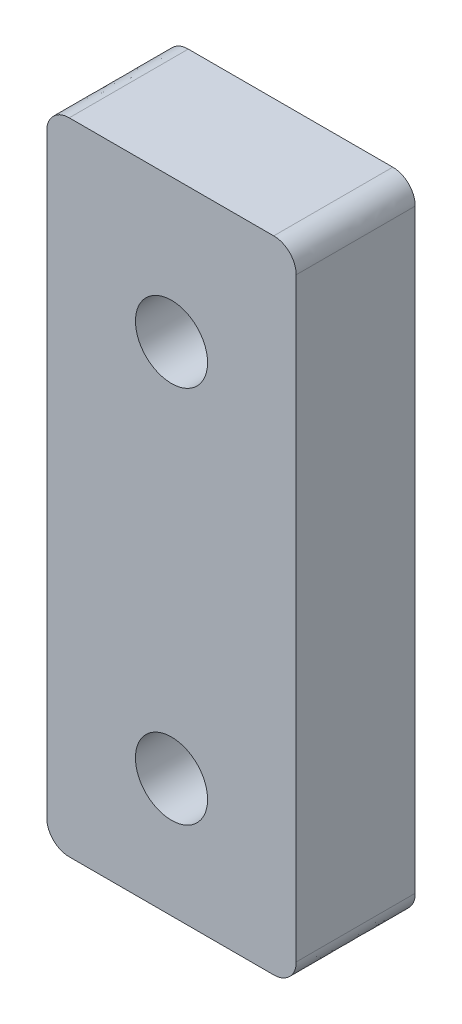
ISO-10303-21;
HEADER;
FILE_DESCRIPTION(('STEP AP214'),'2;1');
FILE_NAME('part.step','',(''),(''),'','','');
FILE_SCHEMA(('AUTOMOTIVE_DESIGN { 1 0 10303 214 1 1 1 1 }'));
ENDSEC;
DATA;
#1=APPLICATION_CONTEXT('core data for automotive mechanical design processes');
#2=APPLICATION_PROTOCOL_DEFINITION('international standard','automotive_design',2000,#1);
#3=PRODUCT_CONTEXT('',#1,'mechanical');
#4=PRODUCT('Part','Part','',(#3));
#5=PRODUCT_RELATED_PRODUCT_CATEGORY('part','',(#4));
#6=PRODUCT_DEFINITION_FORMATION('','',#4);
#7=PRODUCT_DEFINITION_CONTEXT('part definition',#1,'design');
#8=PRODUCT_DEFINITION('design','',#6,#7);
#9=PRODUCT_DEFINITION_SHAPE('','',#8);
#10=(LENGTH_UNIT() NAMED_UNIT(*) SI_UNIT(.MILLI.,.METRE.));
#11=(NAMED_UNIT(*) PLANE_ANGLE_UNIT() SI_UNIT($,.RADIAN.));
#12=(NAMED_UNIT(*) SI_UNIT($,.STERADIAN.) SOLID_ANGLE_UNIT());
#13=UNCERTAINTY_MEASURE_WITH_UNIT(LENGTH_MEASURE(1.E-05),#10,'distance_accuracy_value','');
#14=(GEOMETRIC_REPRESENTATION_CONTEXT(3) GLOBAL_UNCERTAINTY_ASSIGNED_CONTEXT((#13)) GLOBAL_UNIT_ASSIGNED_CONTEXT((#10,
#11,#12)) REPRESENTATION_CONTEXT('',''));
#15=CARTESIAN_POINT('',(0.,0.,0.));
#16=DIRECTION('',(0.,0.,1.));
#17=DIRECTION('',(1.,0.,0.));
#18=AXIS2_PLACEMENT_3D('',#15,#16,#17);
#19=CARTESIAN_POINT('',(-243.94235,141.1679875,6.35));
#20=DIRECTION('',(0.,0.,1.));
#21=DIRECTION('',(1.,0.,0.));
#22=AXIS2_PLACEMENT_3D('',#19,#20,#21);
#23=PLANE('',#22);
#24=CARTESIAN_POINT('',(-250.245,133.8944,6.35));
#25=DIRECTION('',(0.,0.,1.));
#26=DIRECTION('',(1.,0.,0.));
#27=AXIS2_PLACEMENT_3D('',#24,#25,#26);
#28=CIRCLE('',#27,1.92430000000001);
#29=CARTESIAN_POINT('',(-248.3207,133.8944,6.35));
#30=VERTEX_POINT('',#29);
#31=EDGE_CURVE('E208',#30,#30,#28,.T.);
#32=ORIENTED_EDGE('',*,*,#31,.F.);
#33=EDGE_LOOP('',(#32));
#34=FACE_BOUND('',#33,.T.);
#35=CARTESIAN_POINT('',(-243.5919,140.3197,6.35));
#36=CARTESIAN_POINT('',(-243.5919,140.9838,6.35));
#37=CARTESIAN_POINT('',(-244.1268,141.5182,6.35));
#38=CARTESIAN_POINT('',(-244.7908,141.5182,6.35));
#39=B_SPLINE_CURVE_WITH_KNOTS('',3,(#35,#36,#37,#38),.UNSPECIFIED.,.F.,.F.,(4,4),
(0.111111111111111,0.222222222222222),.UNSPECIFIED.);
#40=CARTESIAN_POINT('',(-243.5919,140.3197,6.35));
#41=VERTEX_POINT('',#40);
#42=CARTESIAN_POINT('',(-244.7908,141.5182,6.35));
#43=VERTEX_POINT('',#42);
#44=EDGE_CURVE('E213',#41,#43,#39,.T.);
#45=ORIENTED_EDGE('',*,*,#44,.T.);
#46=DIRECTION('',(-1.,0.,0.));
#47=VECTOR('',#46,1.);
#48=CARTESIAN_POINT('',(-255.7004,141.5182,6.35));
#49=LINE('',#48,#47);
#50=CARTESIAN_POINT('',(-255.7004,141.5182,6.35));
#51=VERTEX_POINT('',#50);
#52=EDGE_CURVE('E94',#43,#51,#49,.T.);
#53=ORIENTED_EDGE('',*,*,#52,.T.);
#54=CARTESIAN_POINT('',(-255.7004,141.5182,6.35));
#55=CARTESIAN_POINT('',(-256.3648,141.5182,6.35));
#56=CARTESIAN_POINT('',(-256.8997,140.9838,6.35));
#57=CARTESIAN_POINT('',(-256.8997,140.3197,6.35));
#58=B_SPLINE_CURVE_WITH_KNOTS('',3,(#54,#55,#56,#57),.UNSPECIFIED.,.F.,.F.,(4,4),
(0.777777777777778,1.),.UNSPECIFIED.);
#59=CARTESIAN_POINT('',(-256.8997,140.3197,6.35));
#60=VERTEX_POINT('',#59);
#61=EDGE_CURVE('E160',#51,#60,#58,.T.);
#62=ORIENTED_EDGE('',*,*,#61,.T.);
#63=DIRECTION('',(0.,-1.,0.));
#64=VECTOR('',#63,1.);
#65=CARTESIAN_POINT('',(-256.8997,108.5737,6.35));
#66=LINE('',#65,#64);
#67=CARTESIAN_POINT('',(-256.8997,108.5737,6.35));
#68=VERTEX_POINT('',#67);
#69=EDGE_CURVE('E155',#60,#68,#66,.T.);
#70=ORIENTED_EDGE('',*,*,#69,.T.);
#71=CARTESIAN_POINT('',(-256.8997,108.5737,6.35));
#72=CARTESIAN_POINT('',(-256.8997,107.9096,6.35));
#73=CARTESIAN_POINT('',(-256.3648,107.3747,6.35));
#74=CARTESIAN_POINT('',(-255.7004,107.3747,6.35));
#75=B_SPLINE_CURVE_WITH_KNOTS('',3,(#71,#72,#73,#74),.UNSPECIFIED.,.F.,.F.,(4,4),
(0.555555555555556,0.666666666666667),.UNSPECIFIED.);
#76=CARTESIAN_POINT('',(-255.7004,107.3747,6.35));
#77=VERTEX_POINT('',#76);
#78=EDGE_CURVE('E113',#68,#77,#75,.T.);
#79=ORIENTED_EDGE('',*,*,#78,.T.);
#80=DIRECTION('',(1.,0.,0.));
#81=VECTOR('',#80,1.);
#82=CARTESIAN_POINT('',(-244.7908,107.3747,6.35));
#83=LINE('',#82,#81);
#84=CARTESIAN_POINT('',(-244.7908,107.3747,6.35));
#85=VERTEX_POINT('',#84);
#86=EDGE_CURVE('E107',#77,#85,#83,.T.);
#87=ORIENTED_EDGE('',*,*,#86,.T.);
#88=CARTESIAN_POINT('',(-244.7908,107.3747,6.35));
#89=CARTESIAN_POINT('',(-244.1268,107.3747,6.35));
#90=CARTESIAN_POINT('',(-243.5919,107.9096,6.35));
#91=CARTESIAN_POINT('',(-243.5919,108.5737,6.35));
#92=B_SPLINE_CURVE_WITH_KNOTS('',3,(#88,#89,#90,#91),.UNSPECIFIED.,.F.,.F.,(4,4),
(0.333333333333333,0.444444444444444),.UNSPECIFIED.);
#93=CARTESIAN_POINT('',(-243.5919,108.5737,6.35));
#94=VERTEX_POINT('',#93);
#95=EDGE_CURVE('E111',#85,#94,#92,.T.);
#96=ORIENTED_EDGE('',*,*,#95,.T.);
#97=DIRECTION('',(0.,1.,0.));
#98=VECTOR('',#97,1.);
#99=CARTESIAN_POINT('',(-243.5919,140.3197,6.35));
#100=LINE('',#99,#98);
#101=EDGE_CURVE('E51',#94,#41,#100,.T.);
#102=ORIENTED_EDGE('',*,*,#101,.T.);
#103=EDGE_LOOP('',(#45,#53,#62,#70,#79,#87,#96,#102));
#104=FACE_BOUND('',#103,.T.);
#105=CARTESIAN_POINT('',(-250.245,113.71655,6.35));
#106=DIRECTION('',(0.,0.,1.));
#107=DIRECTION('',(1.,0.,0.));
#108=AXIS2_PLACEMENT_3D('',#105,#106,#107);
#109=CIRCLE('',#108,1.92514999999998);
#110=CARTESIAN_POINT('',(-248.31985,113.71655,6.35));
#111=VERTEX_POINT('',#110);
#112=EDGE_CURVE('E199',#111,#111,#109,.T.);
#113=ORIENTED_EDGE('',*,*,#112,.F.);
#114=EDGE_LOOP('',(#113));
#115=FACE_BOUND('',#114,.T.);
#116=ADVANCED_FACE('F33',(#34,#104,#115),#23,.T.);
#117=CARTESIAN_POINT('',(-243.94235,141.1679875,0.));
#118=DIRECTION('',(0.,0.,1.));
#119=DIRECTION('',(1.,0.,0.));
#120=AXIS2_PLACEMENT_3D('',#117,#118,#119);
#121=PLANE('',#120);
#122=CARTESIAN_POINT('',(-243.5919,140.3197,0.));
#123=CARTESIAN_POINT('',(-243.5919,140.9838,0.));
#124=CARTESIAN_POINT('',(-244.1268,141.5182,0.));
#125=CARTESIAN_POINT('',(-244.7908,141.5182,0.));
#126=B_SPLINE_CURVE_WITH_KNOTS('',3,(#122,#123,#124,#125),.UNSPECIFIED.,.F.,.F.,(4,4),
(0.111111111111111,0.222222222222222),.UNSPECIFIED.);
#127=CARTESIAN_POINT('',(-243.5919,140.3197,0.));
#128=VERTEX_POINT('',#127);
#129=CARTESIAN_POINT('',(-244.7908,141.5182,0.));
#130=VERTEX_POINT('',#129);
#131=EDGE_CURVE('E211',#128,#130,#126,.T.);
#132=ORIENTED_EDGE('',*,*,#131,.F.);
#133=DIRECTION('',(0.,1.,0.));
#134=VECTOR('',#133,1.);
#135=CARTESIAN_POINT('',(-243.5919,140.3197,0.));
#136=LINE('',#135,#134);
#137=CARTESIAN_POINT('',(-243.5919,108.5737,0.));
#138=VERTEX_POINT('',#137);
#139=EDGE_CURVE('E86',#138,#128,#136,.T.);
#140=ORIENTED_EDGE('',*,*,#139,.F.);
#141=CARTESIAN_POINT('',(-244.7908,107.3747,0.));
#142=CARTESIAN_POINT('',(-244.1268,107.3747,0.));
#143=CARTESIAN_POINT('',(-243.5919,107.9096,0.));
#144=CARTESIAN_POINT('',(-243.5919,108.5737,0.));
#145=B_SPLINE_CURVE_WITH_KNOTS('',3,(#141,#142,#143,#144),.UNSPECIFIED.,.F.,.F.,(4,4),
(0.333333333333333,0.444444444444444),.UNSPECIFIED.);
#146=CARTESIAN_POINT('',(-244.7908,107.3747,0.));
#147=VERTEX_POINT('',#146);
#148=EDGE_CURVE('E80',#147,#138,#145,.T.);
#149=ORIENTED_EDGE('',*,*,#148,.F.);
#150=DIRECTION('',(1.,0.,0.));
#151=VECTOR('',#150,1.);
#152=CARTESIAN_POINT('',(-244.7908,107.3747,0.));
#153=LINE('',#152,#151);
#154=CARTESIAN_POINT('',(-255.7004,107.3747,0.));
#155=VERTEX_POINT('',#154);
#156=EDGE_CURVE('E121',#155,#147,#153,.T.);
#157=ORIENTED_EDGE('',*,*,#156,.F.);
#158=CARTESIAN_POINT('',(-256.8997,108.5737,0.));
#159=CARTESIAN_POINT('',(-256.8997,107.9096,0.));
#160=CARTESIAN_POINT('',(-256.3648,107.3747,0.));
#161=CARTESIAN_POINT('',(-255.7004,107.3747,0.));
#162=B_SPLINE_CURVE_WITH_KNOTS('',3,(#158,#159,#160,#161),.UNSPECIFIED.,.F.,.F.,(4,4),
(0.555555555555556,0.666666666666667),.UNSPECIFIED.);
#163=CARTESIAN_POINT('',(-256.8997,108.5737,0.));
#164=VERTEX_POINT('',#163);
#165=EDGE_CURVE('E248',#164,#155,#162,.T.);
#166=ORIENTED_EDGE('',*,*,#165,.F.);
#167=DIRECTION('',(0.,-1.,0.));
#168=VECTOR('',#167,1.);
#169=CARTESIAN_POINT('',(-256.8997,108.5737,0.));
#170=LINE('',#169,#168);
#171=CARTESIAN_POINT('',(-256.8997,140.3197,0.));
#172=VERTEX_POINT('',#171);
#173=EDGE_CURVE('E246',#172,#164,#170,.T.);
#174=ORIENTED_EDGE('',*,*,#173,.F.);
#175=CARTESIAN_POINT('',(-255.7004,141.5182,0.));
#176=CARTESIAN_POINT('',(-256.3648,141.5182,0.));
#177=CARTESIAN_POINT('',(-256.8997,140.9838,0.));
#178=CARTESIAN_POINT('',(-256.8997,140.3197,0.));
#179=B_SPLINE_CURVE_WITH_KNOTS('',3,(#175,#176,#177,#178),.UNSPECIFIED.,.F.,.F.,(4,4),
(0.777777777777778,1.),.UNSPECIFIED.);
#180=CARTESIAN_POINT('',(-255.7004,141.5182,0.));
#181=VERTEX_POINT('',#180);
#182=EDGE_CURVE('E240',#181,#172,#179,.T.);
#183=ORIENTED_EDGE('',*,*,#182,.F.);
#184=DIRECTION('',(-1.,0.,0.));
#185=VECTOR('',#184,1.);
#186=CARTESIAN_POINT('',(-255.7004,141.5182,0.));
#187=LINE('',#186,#185);
#188=EDGE_CURVE('E244',#130,#181,#187,.T.);
#189=ORIENTED_EDGE('',*,*,#188,.F.);
#190=EDGE_LOOP('',(#132,#140,#149,#157,#166,#174,#183,#189));
#191=FACE_BOUND('',#190,.T.);
#192=CARTESIAN_POINT('',(-250.245,133.8944,0.));
#193=DIRECTION('',(0.,0.,1.));
#194=DIRECTION('',(1.,0.,0.));
#195=AXIS2_PLACEMENT_3D('',#192,#193,#194);
#196=CIRCLE('',#195,1.92430000000001);
#197=CARTESIAN_POINT('',(-248.3207,133.8944,0.));
#198=VERTEX_POINT('',#197);
#199=EDGE_CURVE('E205',#198,#198,#196,.T.);
#200=ORIENTED_EDGE('',*,*,#199,.T.);
#201=EDGE_LOOP('',(#200));
#202=FACE_BOUND('',#201,.T.);
#203=CARTESIAN_POINT('',(-250.245,113.71655,0.));
#204=DIRECTION('',(0.,0.,1.));
#205=DIRECTION('',(1.,0.,0.));
#206=AXIS2_PLACEMENT_3D('',#203,#204,#205);
#207=CIRCLE('',#206,1.92514999999998);
#208=CARTESIAN_POINT('',(-248.31985,113.71655,0.));
#209=VERTEX_POINT('',#208);
#210=EDGE_CURVE('E202',#209,#209,#207,.T.);
#211=ORIENTED_EDGE('',*,*,#210,.T.);
#212=EDGE_LOOP('',(#211));
#213=FACE_BOUND('',#212,.T.);
#214=ADVANCED_FACE('F176',(#191,#202,#213),#121,.F.);
#215=DIRECTION('',(0.,0.,-1.));
#216=VECTOR('',#215,1.);
#217=SURFACE_OF_LINEAR_EXTRUSION('',#39,#216);
#218=ORIENTED_EDGE('',*,*,#131,.T.);
#219=DIRECTION('',(0.,0.,-1.));
#220=VECTOR('',#219,1.);
#221=CARTESIAN_POINT('',(-244.7908,141.5182,6.35));
#222=LINE('',#221,#220);
#223=EDGE_CURVE('E11',#43,#130,#222,.T.);
#224=ORIENTED_EDGE('',*,*,#223,.F.);
#225=ORIENTED_EDGE('',*,*,#44,.F.);
#226=DIRECTION('',(0.,0.,-1.));
#227=VECTOR('',#226,1.);
#228=CARTESIAN_POINT('',(-243.5919,140.3197,6.35));
#229=LINE('',#228,#227);
#230=EDGE_CURVE('E127',#41,#128,#229,.T.);
#231=ORIENTED_EDGE('',*,*,#230,.T.);
#232=EDGE_LOOP('',(#218,#224,#225,#231));
#233=FACE_BOUND('',#232,.T.);
#234=ADVANCED_FACE('F35',(#233),#217,.F.);
#235=CARTESIAN_POINT('',(-255.7004,141.5182,6.35));
#236=DIRECTION('',(0.,-1.,0.));
#237=DIRECTION('',(0.,0.,-1.));
#238=AXIS2_PLACEMENT_3D('',#235,#236,#237);
#239=PLANE('',#238);
#240=ORIENTED_EDGE('',*,*,#188,.T.);
#241=DIRECTION('',(0.,0.,-1.));
#242=VECTOR('',#241,1.);
#243=CARTESIAN_POINT('',(-255.7004,141.5182,6.35));
#244=LINE('',#243,#242);
#245=EDGE_CURVE('E43',#51,#181,#244,.T.);
#246=ORIENTED_EDGE('',*,*,#245,.F.);
#247=ORIENTED_EDGE('',*,*,#52,.F.);
#248=ORIENTED_EDGE('',*,*,#223,.T.);
#249=EDGE_LOOP('',(#240,#246,#247,#248));
#250=FACE_BOUND('',#249,.T.);
#251=ADVANCED_FACE('F170',(#250),#239,.F.);
#252=DIRECTION('',(0.,0.,-1.));
#253=VECTOR('',#252,1.);
#254=SURFACE_OF_LINEAR_EXTRUSION('',#58,#253);
#255=ORIENTED_EDGE('',*,*,#182,.T.);
#256=DIRECTION('',(0.,0.,-1.));
#257=VECTOR('',#256,1.);
#258=CARTESIAN_POINT('',(-256.8997,140.3197,6.35));
#259=LINE('',#258,#257);
#260=EDGE_CURVE('E234',#60,#172,#259,.T.);
#261=ORIENTED_EDGE('',*,*,#260,.F.);
#262=ORIENTED_EDGE('',*,*,#61,.F.);
#263=ORIENTED_EDGE('',*,*,#245,.T.);
#264=EDGE_LOOP('',(#255,#261,#262,#263));
#265=FACE_BOUND('',#264,.T.);
#266=ADVANCED_FACE('F168',(#265),#254,.F.);
#267=CARTESIAN_POINT('',(-256.8997,108.5737,6.35));
#268=DIRECTION('',(1.,0.,0.));
#269=DIRECTION('',(0.,0.,-1.));
#270=AXIS2_PLACEMENT_3D('',#267,#268,#269);
#271=PLANE('',#270);
#272=ORIENTED_EDGE('',*,*,#173,.T.);
#273=DIRECTION('',(0.,0.,-1.));
#274=VECTOR('',#273,1.);
#275=CARTESIAN_POINT('',(-256.8997,108.5737,6.35));
#276=LINE('',#275,#274);
#277=EDGE_CURVE('E231',#68,#164,#276,.T.);
#278=ORIENTED_EDGE('',*,*,#277,.F.);
#279=ORIENTED_EDGE('',*,*,#69,.F.);
#280=ORIENTED_EDGE('',*,*,#260,.T.);
#281=EDGE_LOOP('',(#272,#278,#279,#280));
#282=FACE_BOUND('',#281,.T.);
#283=ADVANCED_FACE('F148',(#282),#271,.F.);
#284=DIRECTION('',(0.,0.,-1.));
#285=VECTOR('',#284,1.);
#286=SURFACE_OF_LINEAR_EXTRUSION('',#75,#285);
#287=ORIENTED_EDGE('',*,*,#165,.T.);
#288=DIRECTION('',(0.,0.,-1.));
#289=VECTOR('',#288,1.);
#290=CARTESIAN_POINT('',(-255.7004,107.3747,6.35));
#291=LINE('',#290,#289);
#292=EDGE_CURVE('E122',#77,#155,#291,.T.);
#293=ORIENTED_EDGE('',*,*,#292,.F.);
#294=ORIENTED_EDGE('',*,*,#78,.F.);
#295=ORIENTED_EDGE('',*,*,#277,.T.);
#296=EDGE_LOOP('',(#287,#293,#294,#295));
#297=FACE_BOUND('',#296,.T.);
#298=ADVANCED_FACE('F145',(#297),#286,.F.);
#299=CARTESIAN_POINT('',(-244.7908,107.3747,6.35));
#300=DIRECTION('',(0.,1.,0.));
#301=DIRECTION('',(0.,0.,1.));
#302=AXIS2_PLACEMENT_3D('',#299,#300,#301);
#303=PLANE('',#302);
#304=ORIENTED_EDGE('',*,*,#156,.T.);
#305=DIRECTION('',(0.,0.,-1.));
#306=VECTOR('',#305,1.);
#307=CARTESIAN_POINT('',(-244.7908,107.3747,6.35));
#308=LINE('',#307,#306);
#309=EDGE_CURVE('E118',#85,#147,#308,.T.);
#310=ORIENTED_EDGE('',*,*,#309,.F.);
#311=ORIENTED_EDGE('',*,*,#86,.F.);
#312=ORIENTED_EDGE('',*,*,#292,.T.);
#313=EDGE_LOOP('',(#304,#310,#311,#312));
#314=FACE_BOUND('',#313,.T.);
#315=ADVANCED_FACE('F119',(#314),#303,.F.);
#316=DIRECTION('',(0.,0.,-1.));
#317=VECTOR('',#316,1.);
#318=SURFACE_OF_LINEAR_EXTRUSION('',#92,#317);
#319=ORIENTED_EDGE('',*,*,#148,.T.);
#320=DIRECTION('',(0.,0.,-1.));
#321=VECTOR('',#320,1.);
#322=CARTESIAN_POINT('',(-243.5919,108.5737,6.35));
#323=LINE('',#322,#321);
#324=EDGE_CURVE('E123',#94,#138,#323,.T.);
#325=ORIENTED_EDGE('',*,*,#324,.F.);
#326=ORIENTED_EDGE('',*,*,#95,.F.);
#327=ORIENTED_EDGE('',*,*,#309,.T.);
#328=EDGE_LOOP('',(#319,#325,#326,#327));
#329=FACE_BOUND('',#328,.T.);
#330=ADVANCED_FACE('F125',(#329),#318,.F.);
#331=CARTESIAN_POINT('',(-243.5919,140.3197,6.35));
#332=DIRECTION('',(-1.,0.,0.));
#333=DIRECTION('',(0.,0.,1.));
#334=AXIS2_PLACEMENT_3D('',#331,#332,#333);
#335=PLANE('',#334);
#336=ORIENTED_EDGE('',*,*,#139,.T.);
#337=ORIENTED_EDGE('',*,*,#230,.F.);
#338=ORIENTED_EDGE('',*,*,#101,.F.);
#339=ORIENTED_EDGE('',*,*,#324,.T.);
#340=EDGE_LOOP('',(#336,#337,#338,#339));
#341=FACE_BOUND('',#340,.T.);
#342=ADVANCED_FACE('F141',(#341),#335,.F.);
#343=CARTESIAN_POINT('',(-250.245,133.8944,6.35));
#344=DIRECTION('',(0.,0.,-1.));
#345=DIRECTION('',(-1.,0.,0.));
#346=AXIS2_PLACEMENT_3D('',#343,#344,#345);
#347=CYLINDRICAL_SURFACE('',#346,1.92430000000001);
#348=ORIENTED_EDGE('',*,*,#31,.T.);
#349=EDGE_LOOP('',(#348));
#350=FACE_BOUND('',#349,.T.);
#351=ORIENTED_EDGE('',*,*,#199,.F.);
#352=EDGE_LOOP('',(#351));
#353=FACE_BOUND('',#352,.T.);
#354=ADVANCED_FACE('F187',(#350,#353),#347,.F.);
#355=CARTESIAN_POINT('',(-250.245,113.71655,6.35));
#356=DIRECTION('',(0.,0.,-1.));
#357=DIRECTION('',(-1.,0.,0.));
#358=AXIS2_PLACEMENT_3D('',#355,#356,#357);
#359=CYLINDRICAL_SURFACE('',#358,1.92514999999998);
#360=ORIENTED_EDGE('',*,*,#112,.T.);
#361=EDGE_LOOP('',(#360));
#362=FACE_BOUND('',#361,.T.);
#363=ORIENTED_EDGE('',*,*,#210,.F.);
#364=EDGE_LOOP('',(#363));
#365=FACE_BOUND('',#364,.T.);
#366=ADVANCED_FACE('F190',(#362,#365),#359,.F.);
#367=CLOSED_SHELL('',(#116,#214,#234,#251,#266,#283,#298,#315,#330,#342,#354,#366));
#368=MANIFOLD_SOLID_BREP('B2',#367);
#369=ADVANCED_BREP_SHAPE_REPRESENTATION('',(#18,#368),#14);
#370=SHAPE_DEFINITION_REPRESENTATION(#9,#369);
ENDSEC;
END-ISO-10303-21;
